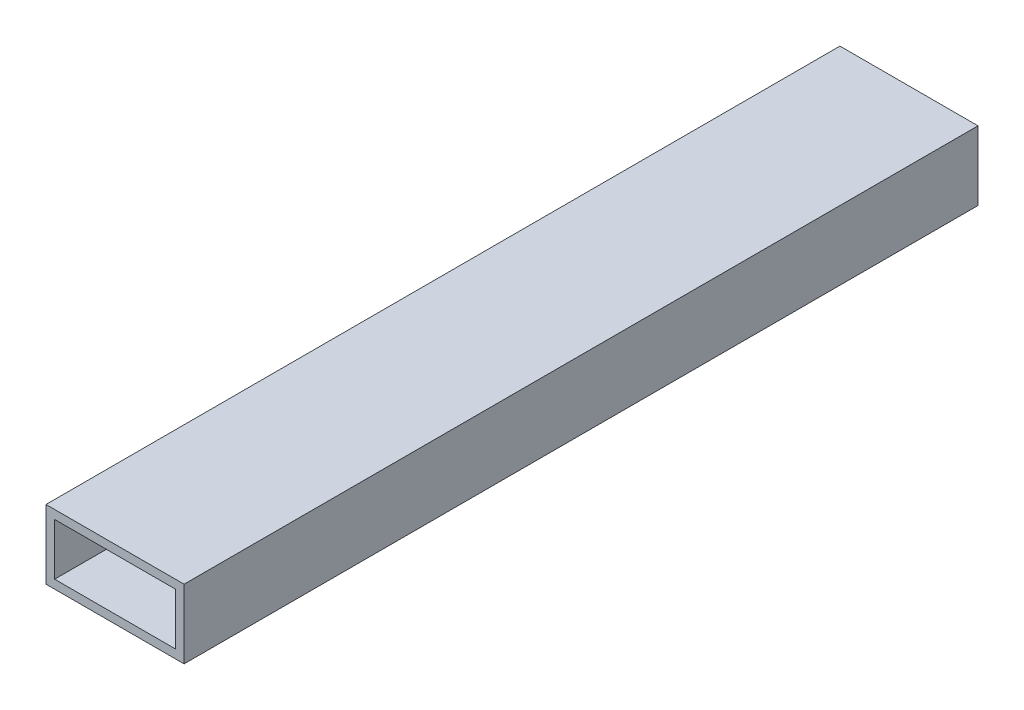
ISO-10303-21;
HEADER;
FILE_DESCRIPTION(('STEP AP214'),'2;1');
FILE_NAME('part.step','',(''),(''),'','','');
FILE_SCHEMA(('AUTOMOTIVE_DESIGN { 1 0 10303 214 1 1 1 1 }'));
ENDSEC;
DATA;
#1=APPLICATION_CONTEXT('core data for automotive mechanical design processes');
#2=APPLICATION_PROTOCOL_DEFINITION('international standard','automotive_design',2000,#1);
#3=PRODUCT_CONTEXT('',#1,'mechanical');
#4=PRODUCT('Part','Part','',(#3));
#5=PRODUCT_RELATED_PRODUCT_CATEGORY('part','',(#4));
#6=PRODUCT_DEFINITION_FORMATION('','',#4);
#7=PRODUCT_DEFINITION_CONTEXT('part definition',#1,'design');
#8=PRODUCT_DEFINITION('design','',#6,#7);
#9=PRODUCT_DEFINITION_SHAPE('','',#8);
#10=(LENGTH_UNIT() NAMED_UNIT(*) SI_UNIT(.MILLI.,.METRE.));
#11=(NAMED_UNIT(*) PLANE_ANGLE_UNIT() SI_UNIT($,.RADIAN.));
#12=(NAMED_UNIT(*) SI_UNIT($,.STERADIAN.) SOLID_ANGLE_UNIT());
#13=UNCERTAINTY_MEASURE_WITH_UNIT(LENGTH_MEASURE(1.E-05),#10,'distance_accuracy_value','');
#14=(GEOMETRIC_REPRESENTATION_CONTEXT(3) GLOBAL_UNCERTAINTY_ASSIGNED_CONTEXT((#13)) GLOBAL_UNIT_ASSIGNED_CONTEXT((#10,
#11,#12)) REPRESENTATION_CONTEXT('',''));
#15=CARTESIAN_POINT('',(0.,0.,0.));
#16=DIRECTION('',(0.,0.,1.));
#17=DIRECTION('',(1.,0.,0.));
#18=AXIS2_PLACEMENT_3D('',#15,#16,#17);
#19=CARTESIAN_POINT('',(0.,0.,292.1));
#20=DIRECTION('',(0.,0.,-1.));
#21=DIRECTION('',(-1.,0.,0.));
#22=AXIS2_PLACEMENT_3D('',#19,#20,#21);
#23=PLANE('',#22);
#24=DIRECTION('',(0.,-1.,0.));
#25=VECTOR('',#24,1.);
#26=CARTESIAN_POINT('',(0.,0.,292.1));
#27=LINE('',#26,#25);
#28=CARTESIAN_POINT('',(0.,25.4,292.1));
#29=VERTEX_POINT('',#28);
#30=CARTESIAN_POINT('',(0.,0.,292.1));
#31=VERTEX_POINT('',#30);
#32=EDGE_CURVE('E134',#29,#31,#27,.T.);
#33=ORIENTED_EDGE('',*,*,#32,.T.);
#34=DIRECTION('',(1.,0.,0.));
#35=VECTOR('',#34,1.);
#36=CARTESIAN_POINT('',(0.,0.,292.1));
#37=LINE('',#36,#35);
#38=CARTESIAN_POINT('',(50.8,0.,292.1));
#39=VERTEX_POINT('',#38);
#40=EDGE_CURVE('E137',#31,#39,#37,.T.);
#41=ORIENTED_EDGE('',*,*,#40,.T.);
#42=DIRECTION('',(0.,1.,0.));
#43=VECTOR('',#42,1.);
#44=CARTESIAN_POINT('',(50.8,0.,292.1));
#45=LINE('',#44,#43);
#46=CARTESIAN_POINT('',(50.8,25.4,292.1));
#47=VERTEX_POINT('',#46);
#48=EDGE_CURVE('E140',#39,#47,#45,.T.);
#49=ORIENTED_EDGE('',*,*,#48,.T.);
#50=DIRECTION('',(-1.,0.,0.));
#51=VECTOR('',#50,1.);
#52=CARTESIAN_POINT('',(0.,25.4,292.1));
#53=LINE('',#52,#51);
#54=EDGE_CURVE('E142',#47,#29,#53,.T.);
#55=ORIENTED_EDGE('',*,*,#54,.T.);
#56=EDGE_LOOP('',(#33,#41,#49,#55));
#57=FACE_BOUND('',#56,.T.);
#58=DIRECTION('',(0.,-1.,0.));
#59=VECTOR('',#58,1.);
#60=CARTESIAN_POINT('',(3.175,3.175,292.1));
#61=LINE('',#60,#59);
#62=CARTESIAN_POINT('',(3.175,22.225,292.1));
#63=VERTEX_POINT('',#62);
#64=CARTESIAN_POINT('',(3.175,3.175,292.1));
#65=VERTEX_POINT('',#64);
#66=EDGE_CURVE('E98',#63,#65,#61,.T.);
#67=ORIENTED_EDGE('',*,*,#66,.F.);
#68=DIRECTION('',(-1.,0.,0.));
#69=VECTOR('',#68,1.);
#70=CARTESIAN_POINT('',(3.175,22.225,292.1));
#71=LINE('',#70,#69);
#72=CARTESIAN_POINT('',(47.625,22.225,292.1));
#73=VERTEX_POINT('',#72);
#74=EDGE_CURVE('E120',#73,#63,#71,.T.);
#75=ORIENTED_EDGE('',*,*,#74,.F.);
#76=DIRECTION('',(0.,1.,0.));
#77=VECTOR('',#76,1.);
#78=CARTESIAN_POINT('',(47.625,3.175,292.1));
#79=LINE('',#78,#77);
#80=CARTESIAN_POINT('',(47.625,3.175,292.1));
#81=VERTEX_POINT('',#80);
#82=EDGE_CURVE('E118',#81,#73,#79,.T.);
#83=ORIENTED_EDGE('',*,*,#82,.F.);
#84=DIRECTION('',(1.,0.,0.));
#85=VECTOR('',#84,1.);
#86=CARTESIAN_POINT('',(3.175,3.175,292.1));
#87=LINE('',#86,#85);
#88=EDGE_CURVE('E106',#65,#81,#87,.T.);
#89=ORIENTED_EDGE('',*,*,#88,.F.);
#90=EDGE_LOOP('',(#67,#75,#83,#89));
#91=FACE_BOUND('',#90,.T.);
#92=ADVANCED_FACE('F33',(#57,#91),#23,.F.);
#93=CARTESIAN_POINT('',(0.,0.,0.));
#94=DIRECTION('',(0.,0.,-1.));
#95=DIRECTION('',(-1.,0.,0.));
#96=AXIS2_PLACEMENT_3D('',#93,#94,#95);
#97=PLANE('',#96);
#98=DIRECTION('',(0.,-1.,0.));
#99=VECTOR('',#98,1.);
#100=CARTESIAN_POINT('',(0.,0.,0.));
#101=LINE('',#100,#99);
#102=CARTESIAN_POINT('',(0.,25.4,0.));
#103=VERTEX_POINT('',#102);
#104=CARTESIAN_POINT('',(0.,0.,0.));
#105=VERTEX_POINT('',#104);
#106=EDGE_CURVE('E114',#103,#105,#101,.T.);
#107=ORIENTED_EDGE('',*,*,#106,.F.);
#108=DIRECTION('',(-1.,0.,0.));
#109=VECTOR('',#108,1.);
#110=CARTESIAN_POINT('',(0.,25.4,0.));
#111=LINE('',#110,#109);
#112=CARTESIAN_POINT('',(50.8,25.4,0.));
#113=VERTEX_POINT('',#112);
#114=EDGE_CURVE('E138',#113,#103,#111,.T.);
#115=ORIENTED_EDGE('',*,*,#114,.F.);
#116=DIRECTION('',(0.,1.,0.));
#117=VECTOR('',#116,1.);
#118=CARTESIAN_POINT('',(50.8,0.,0.));
#119=LINE('',#118,#117);
#120=CARTESIAN_POINT('',(50.8,0.,0.));
#121=VERTEX_POINT('',#120);
#122=EDGE_CURVE('E149',#121,#113,#119,.T.);
#123=ORIENTED_EDGE('',*,*,#122,.F.);
#124=DIRECTION('',(1.,0.,0.));
#125=VECTOR('',#124,1.);
#126=CARTESIAN_POINT('',(0.,0.,0.));
#127=LINE('',#126,#125);
#128=EDGE_CURVE('E147',#105,#121,#127,.T.);
#129=ORIENTED_EDGE('',*,*,#128,.F.);
#130=EDGE_LOOP('',(#107,#115,#123,#129));
#131=FACE_BOUND('',#130,.T.);
#132=DIRECTION('',(-1.,0.,0.));
#133=VECTOR('',#132,1.);
#134=CARTESIAN_POINT('',(3.175,22.225,0.));
#135=LINE('',#134,#133);
#136=CARTESIAN_POINT('',(47.625,22.225,0.));
#137=VERTEX_POINT('',#136);
#138=CARTESIAN_POINT('',(3.175,22.225,0.));
#139=VERTEX_POINT('',#138);
#140=EDGE_CURVE('E107',#137,#139,#135,.T.);
#141=ORIENTED_EDGE('',*,*,#140,.T.);
#142=DIRECTION('',(0.,-1.,0.));
#143=VECTOR('',#142,1.);
#144=CARTESIAN_POINT('',(3.175,3.175,0.));
#145=LINE('',#144,#143);
#146=CARTESIAN_POINT('',(3.175,3.175,0.));
#147=VERTEX_POINT('',#146);
#148=EDGE_CURVE('E56',#139,#147,#145,.T.);
#149=ORIENTED_EDGE('',*,*,#148,.T.);
#150=DIRECTION('',(1.,0.,0.));
#151=VECTOR('',#150,1.);
#152=CARTESIAN_POINT('',(3.175,3.175,0.));
#153=LINE('',#152,#151);
#154=CARTESIAN_POINT('',(47.625,3.175,0.));
#155=VERTEX_POINT('',#154);
#156=EDGE_CURVE('E113',#147,#155,#153,.T.);
#157=ORIENTED_EDGE('',*,*,#156,.T.);
#158=DIRECTION('',(0.,1.,0.));
#159=VECTOR('',#158,1.);
#160=CARTESIAN_POINT('',(47.625,3.175,0.));
#161=LINE('',#160,#159);
#162=EDGE_CURVE('E126',#155,#137,#161,.T.);
#163=ORIENTED_EDGE('',*,*,#162,.T.);
#164=EDGE_LOOP('',(#141,#149,#157,#163));
#165=FACE_BOUND('',#164,.T.);
#166=ADVANCED_FACE('F167',(#131,#165),#97,.T.);
#167=CARTESIAN_POINT('',(0.,0.,292.1));
#168=DIRECTION('',(1.,0.,0.));
#169=DIRECTION('',(0.,1.,0.));
#170=AXIS2_PLACEMENT_3D('',#167,#168,#169);
#171=PLANE('',#170);
#172=ORIENTED_EDGE('',*,*,#106,.T.);
#173=DIRECTION('',(0.,0.,-1.));
#174=VECTOR('',#173,1.);
#175=CARTESIAN_POINT('',(0.,0.,292.1));
#176=LINE('',#175,#174);
#177=EDGE_CURVE('E11',#31,#105,#176,.T.);
#178=ORIENTED_EDGE('',*,*,#177,.F.);
#179=ORIENTED_EDGE('',*,*,#32,.F.);
#180=DIRECTION('',(0.,0.,-1.));
#181=VECTOR('',#180,1.);
#182=CARTESIAN_POINT('',(0.,25.4,292.1));
#183=LINE('',#182,#181);
#184=EDGE_CURVE('E144',#29,#103,#183,.T.);
#185=ORIENTED_EDGE('',*,*,#184,.T.);
#186=EDGE_LOOP('',(#172,#178,#179,#185));
#187=FACE_BOUND('',#186,.T.);
#188=ADVANCED_FACE('F35',(#187),#171,.F.);
#189=CARTESIAN_POINT('',(0.,0.,292.1));
#190=DIRECTION('',(0.,1.,0.));
#191=DIRECTION('',(0.,0.,1.));
#192=AXIS2_PLACEMENT_3D('',#189,#190,#191);
#193=PLANE('',#192);
#194=ORIENTED_EDGE('',*,*,#128,.T.);
#195=DIRECTION('',(0.,0.,-1.));
#196=VECTOR('',#195,1.);
#197=CARTESIAN_POINT('',(50.8,0.,292.1));
#198=LINE('',#197,#196);
#199=EDGE_CURVE('E41',#39,#121,#198,.T.);
#200=ORIENTED_EDGE('',*,*,#199,.F.);
#201=ORIENTED_EDGE('',*,*,#40,.F.);
#202=ORIENTED_EDGE('',*,*,#177,.T.);
#203=EDGE_LOOP('',(#194,#200,#201,#202));
#204=FACE_BOUND('',#203,.T.);
#205=ADVANCED_FACE('F177',(#204),#193,.F.);
#206=CARTESIAN_POINT('',(50.8,0.,292.1));
#207=DIRECTION('',(-1.,0.,0.));
#208=DIRECTION('',(0.,-1.,0.));
#209=AXIS2_PLACEMENT_3D('',#206,#207,#208);
#210=PLANE('',#209);
#211=ORIENTED_EDGE('',*,*,#122,.T.);
#212=DIRECTION('',(0.,0.,-1.));
#213=VECTOR('',#212,1.);
#214=CARTESIAN_POINT('',(50.8,25.4,292.1));
#215=LINE('',#214,#213);
#216=EDGE_CURVE('E154',#47,#113,#215,.T.);
#217=ORIENTED_EDGE('',*,*,#216,.F.);
#218=ORIENTED_EDGE('',*,*,#48,.F.);
#219=ORIENTED_EDGE('',*,*,#199,.T.);
#220=EDGE_LOOP('',(#211,#217,#218,#219));
#221=FACE_BOUND('',#220,.T.);
#222=ADVANCED_FACE('F161',(#221),#210,.F.);
#223=CARTESIAN_POINT('',(0.,25.4,292.1));
#224=DIRECTION('',(0.,-1.,0.));
#225=DIRECTION('',(0.,0.,-1.));
#226=AXIS2_PLACEMENT_3D('',#223,#224,#225);
#227=PLANE('',#226);
#228=ORIENTED_EDGE('',*,*,#114,.T.);
#229=ORIENTED_EDGE('',*,*,#184,.F.);
#230=ORIENTED_EDGE('',*,*,#54,.F.);
#231=ORIENTED_EDGE('',*,*,#216,.T.);
#232=EDGE_LOOP('',(#228,#229,#230,#231));
#233=FACE_BOUND('',#232,.T.);
#234=ADVANCED_FACE('F171',(#233),#227,.F.);
#235=CARTESIAN_POINT('',(3.175,3.175,292.1));
#236=DIRECTION('',(1.,0.,0.));
#237=DIRECTION('',(0.,0.,-1.));
#238=AXIS2_PLACEMENT_3D('',#235,#236,#237);
#239=PLANE('',#238);
#240=ORIENTED_EDGE('',*,*,#148,.F.);
#241=DIRECTION('',(0.,0.,-1.));
#242=VECTOR('',#241,1.);
#243=CARTESIAN_POINT('',(3.175,22.225,292.1));
#244=LINE('',#243,#242);
#245=EDGE_CURVE('E102',#63,#139,#244,.T.);
#246=ORIENTED_EDGE('',*,*,#245,.F.);
#247=ORIENTED_EDGE('',*,*,#66,.T.);
#248=DIRECTION('',(0.,0.,-1.));
#249=VECTOR('',#248,1.);
#250=CARTESIAN_POINT('',(3.175,3.175,292.1));
#251=LINE('',#250,#249);
#252=EDGE_CURVE('E101',#65,#147,#251,.T.);
#253=ORIENTED_EDGE('',*,*,#252,.T.);
#254=EDGE_LOOP('',(#240,#246,#247,#253));
#255=FACE_BOUND('',#254,.T.);
#256=ADVANCED_FACE('F100',(#255),#239,.T.);
#257=CARTESIAN_POINT('',(3.175,3.175,292.1));
#258=DIRECTION('',(0.,1.,0.));
#259=DIRECTION('',(0.,0.,1.));
#260=AXIS2_PLACEMENT_3D('',#257,#258,#259);
#261=PLANE('',#260);
#262=ORIENTED_EDGE('',*,*,#156,.F.);
#263=ORIENTED_EDGE('',*,*,#252,.F.);
#264=ORIENTED_EDGE('',*,*,#88,.T.);
#265=DIRECTION('',(0.,0.,-1.));
#266=VECTOR('',#265,1.);
#267=CARTESIAN_POINT('',(47.625,3.175,292.1));
#268=LINE('',#267,#266);
#269=EDGE_CURVE('E115',#81,#155,#268,.T.);
#270=ORIENTED_EDGE('',*,*,#269,.T.);
#271=EDGE_LOOP('',(#262,#263,#264,#270));
#272=FACE_BOUND('',#271,.T.);
#273=ADVANCED_FACE('F110',(#272),#261,.T.);
#274=CARTESIAN_POINT('',(47.625,3.175,292.1));
#275=DIRECTION('',(-1.,0.,0.));
#276=DIRECTION('',(0.,0.,1.));
#277=AXIS2_PLACEMENT_3D('',#274,#275,#276);
#278=PLANE('',#277);
#279=ORIENTED_EDGE('',*,*,#162,.F.);
#280=ORIENTED_EDGE('',*,*,#269,.F.);
#281=ORIENTED_EDGE('',*,*,#82,.T.);
#282=DIRECTION('',(0.,0.,-1.));
#283=VECTOR('',#282,1.);
#284=CARTESIAN_POINT('',(47.625,22.225,292.1));
#285=LINE('',#284,#283);
#286=EDGE_CURVE('E48',#73,#137,#285,.T.);
#287=ORIENTED_EDGE('',*,*,#286,.T.);
#288=EDGE_LOOP('',(#279,#280,#281,#287));
#289=FACE_BOUND('',#288,.T.);
#290=ADVANCED_FACE('F200',(#289),#278,.T.);
#291=CARTESIAN_POINT('',(3.175,22.225,292.1));
#292=DIRECTION('',(0.,-1.,0.));
#293=DIRECTION('',(0.,0.,-1.));
#294=AXIS2_PLACEMENT_3D('',#291,#292,#293);
#295=PLANE('',#294);
#296=ORIENTED_EDGE('',*,*,#140,.F.);
#297=ORIENTED_EDGE('',*,*,#286,.F.);
#298=ORIENTED_EDGE('',*,*,#74,.T.);
#299=ORIENTED_EDGE('',*,*,#245,.T.);
#300=EDGE_LOOP('',(#296,#297,#298,#299));
#301=FACE_BOUND('',#300,.T.);
#302=ADVANCED_FACE('F204',(#301),#295,.T.);
#303=CLOSED_SHELL('',(#92,#166,#188,#205,#222,#234,#256,#273,#290,#302));
#304=MANIFOLD_SOLID_BREP('B2',#303);
#305=ADVANCED_BREP_SHAPE_REPRESENTATION('',(#18,#304),#14);
#306=SHAPE_DEFINITION_REPRESENTATION(#9,#305);
ENDSEC;
END-ISO-10303-21;
